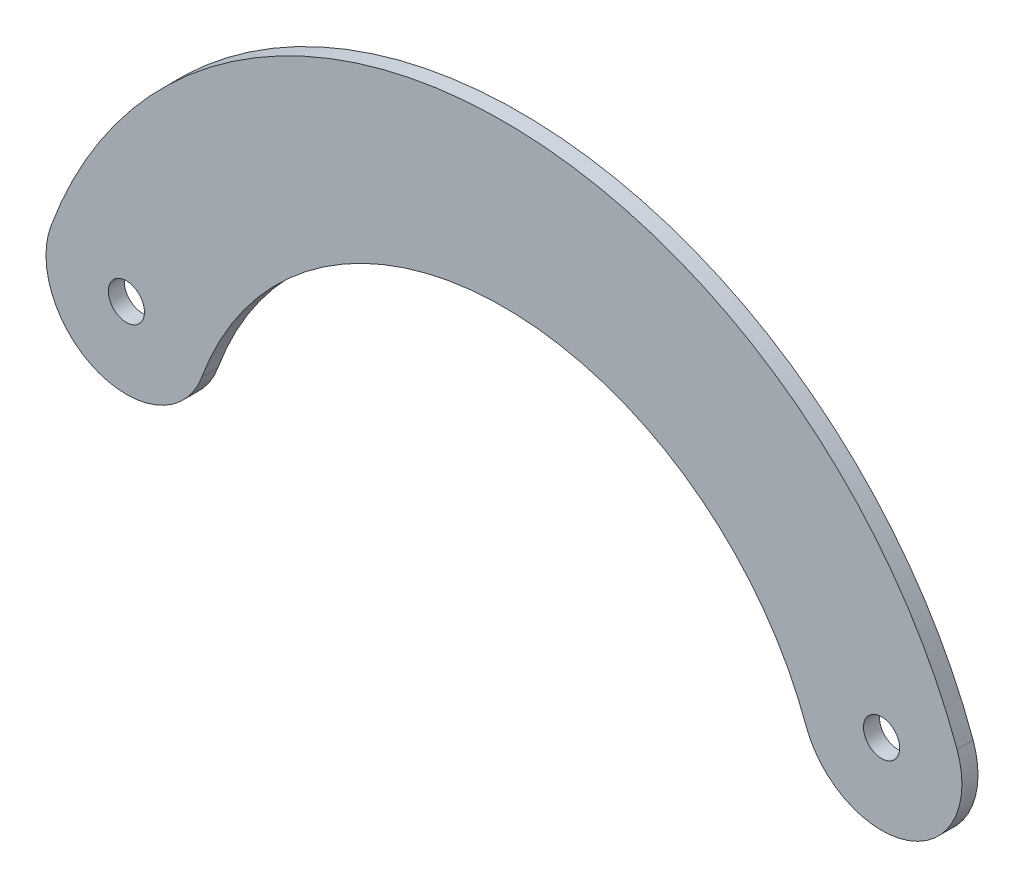
ISO-10303-21;
HEADER;
FILE_DESCRIPTION(('STEP AP214'),'2;1');
FILE_NAME('part.step','',(''),(''),'','','');
FILE_SCHEMA(('AUTOMOTIVE_DESIGN { 1 0 10303 214 1 1 1 1 }'));
ENDSEC;
DATA;
#1=APPLICATION_CONTEXT('core data for automotive mechanical design processes');
#2=APPLICATION_PROTOCOL_DEFINITION('international standard','automotive_design',2000,#1);
#3=PRODUCT_CONTEXT('',#1,'mechanical');
#4=PRODUCT('Part','Part','',(#3));
#5=PRODUCT_RELATED_PRODUCT_CATEGORY('part','',(#4));
#6=PRODUCT_DEFINITION_FORMATION('','',#4);
#7=PRODUCT_DEFINITION_CONTEXT('part definition',#1,'design');
#8=PRODUCT_DEFINITION('design','',#6,#7);
#9=PRODUCT_DEFINITION_SHAPE('','',#8);
#10=(LENGTH_UNIT() NAMED_UNIT(*) SI_UNIT(.MILLI.,.METRE.));
#11=(NAMED_UNIT(*) PLANE_ANGLE_UNIT() SI_UNIT($,.RADIAN.));
#12=(NAMED_UNIT(*) SI_UNIT($,.STERADIAN.) SOLID_ANGLE_UNIT());
#13=UNCERTAINTY_MEASURE_WITH_UNIT(LENGTH_MEASURE(1.E-05),#10,'distance_accuracy_value','');
#14=(GEOMETRIC_REPRESENTATION_CONTEXT(3) GLOBAL_UNCERTAINTY_ASSIGNED_CONTEXT((#13)) GLOBAL_UNIT_ASSIGNED_CONTEXT((#10,
#11,#12)) REPRESENTATION_CONTEXT('',''));
#15=CARTESIAN_POINT('',(0.,0.,0.));
#16=DIRECTION('',(0.,0.,1.));
#17=DIRECTION('',(1.,0.,0.));
#18=AXIS2_PLACEMENT_3D('',#15,#16,#17);
#19=CARTESIAN_POINT('',(-23.4923155196477,8.55050358314164,2.));
#20=DIRECTION('',(0.,0.,1.));
#21=DIRECTION('',(1.,0.,0.));
#22=AXIS2_PLACEMENT_3D('',#19,#20,#21);
#23=PLANE('',#22);
#24=CARTESIAN_POINT('',(-46.9846310392955,17.1010071662833,2.));
#25=DIRECTION('',(0.,0.,1.));
#26=DIRECTION('',(1.,0.,0.));
#27=AXIS2_PLACEMENT_3D('',#24,#25,#26);
#28=CIRCLE('',#27,2.25);
#29=CARTESIAN_POINT('',(-44.7346310392955,17.1010071662833,2.));
#30=VERTEX_POINT('',#29);
#31=EDGE_CURVE('E99',#30,#30,#28,.T.);
#32=ORIENTED_EDGE('',*,*,#31,.F.);
#33=EDGE_LOOP('',(#32));
#34=FACE_BOUND('',#33,.T.);
#35=CARTESIAN_POINT('',(0.,0.,2.));
#36=DIRECTION('',(0.,0.,1.));
#37=DIRECTION('',(1.,0.,0.));
#38=AXIS2_PLACEMENT_3D('',#35,#36,#37);
#39=CIRCLE('',#38,60.);
#40=CARTESIAN_POINT('',(56.3815572471546,20.52120859954,2.));
#41=VERTEX_POINT('',#40);
#42=CARTESIAN_POINT('',(-56.3815572471546,20.5212085995399,2.));
#43=VERTEX_POINT('',#42);
#44=EDGE_CURVE('E84',#41,#43,#39,.T.);
#45=ORIENTED_EDGE('',*,*,#44,.T.);
#46=CARTESIAN_POINT('',(-46.9846310392955,17.1010071662833,2.));
#47=DIRECTION('',(0.,0.,1.));
#48=DIRECTION('',(1.,0.,0.));
#49=AXIS2_PLACEMENT_3D('',#46,#47,#48);
#50=CIRCLE('',#49,10.);
#51=CARTESIAN_POINT('',(-37.5877048314364,13.6808057330266,2.));
#52=VERTEX_POINT('',#51);
#53=EDGE_CURVE('E79',#43,#52,#50,.T.);
#54=ORIENTED_EDGE('',*,*,#53,.T.);
#55=CARTESIAN_POINT('',(0.,0.,2.));
#56=DIRECTION('',(0.,0.,-1.));
#57=DIRECTION('',(1.,0.,0.));
#58=AXIS2_PLACEMENT_3D('',#55,#56,#57);
#59=CIRCLE('',#58,40.);
#60=CARTESIAN_POINT('',(37.5877048314364,13.6808057330266,2.));
#61=VERTEX_POINT('',#60);
#62=EDGE_CURVE('E82',#52,#61,#59,.T.);
#63=ORIENTED_EDGE('',*,*,#62,.T.);
#64=CARTESIAN_POINT('',(46.9846310392955,17.1010071662833,2.));
#65=DIRECTION('',(0.,0.,1.));
#66=DIRECTION('',(1.,0.,0.));
#67=AXIS2_PLACEMENT_3D('',#64,#65,#66);
#68=CIRCLE('',#67,10.);
#69=EDGE_CURVE('E49',#61,#41,#68,.T.);
#70=ORIENTED_EDGE('',*,*,#69,.T.);
#71=EDGE_LOOP('',(#45,#54,#63,#70));
#72=FACE_BOUND('',#71,.T.);
#73=CARTESIAN_POINT('',(46.9846310392955,17.1010071662833,2.));
#74=DIRECTION('',(0.,0.,1.));
#75=DIRECTION('',(1.,0.,0.));
#76=AXIS2_PLACEMENT_3D('',#73,#74,#75);
#77=CIRCLE('',#76,2.25);
#78=CARTESIAN_POINT('',(49.2346310392955,17.1010071662833,2.));
#79=VERTEX_POINT('',#78);
#80=EDGE_CURVE('E114',#79,#79,#77,.T.);
#81=ORIENTED_EDGE('',*,*,#80,.F.);
#82=EDGE_LOOP('',(#81));
#83=FACE_BOUND('',#82,.T.);
#84=ADVANCED_FACE('F32',(#34,#72,#83),#23,.T.);
#85=CARTESIAN_POINT('',(-23.4923155196477,8.55050358314164,0.));
#86=DIRECTION('',(0.,0.,1.));
#87=DIRECTION('',(1.,0.,0.));
#88=AXIS2_PLACEMENT_3D('',#85,#86,#87);
#89=PLANE('',#88);
#90=CARTESIAN_POINT('',(-46.9846310392955,17.1010071662833,0.));
#91=DIRECTION('',(0.,0.,1.));
#92=DIRECTION('',(1.,0.,0.));
#93=AXIS2_PLACEMENT_3D('',#90,#91,#92);
#94=CIRCLE('',#93,2.25);
#95=CARTESIAN_POINT('',(-44.7346310392955,17.1010071662833,0.));
#96=VERTEX_POINT('',#95);
#97=EDGE_CURVE('E111',#96,#96,#94,.T.);
#98=ORIENTED_EDGE('',*,*,#97,.T.);
#99=EDGE_LOOP('',(#98));
#100=FACE_BOUND('',#99,.T.);
#101=CARTESIAN_POINT('',(0.,0.,0.));
#102=DIRECTION('',(0.,0.,1.));
#103=DIRECTION('',(1.,0.,0.));
#104=AXIS2_PLACEMENT_3D('',#101,#102,#103);
#105=CIRCLE('',#104,60.);
#106=CARTESIAN_POINT('',(56.3815572471546,20.52120859954,0.));
#107=VERTEX_POINT('',#106);
#108=CARTESIAN_POINT('',(-56.3815572471546,20.5212085995399,0.));
#109=VERTEX_POINT('',#108);
#110=EDGE_CURVE('E96',#107,#109,#105,.T.);
#111=ORIENTED_EDGE('',*,*,#110,.F.);
#112=CARTESIAN_POINT('',(46.9846310392955,17.1010071662833,0.));
#113=DIRECTION('',(0.,0.,1.));
#114=DIRECTION('',(1.,0.,0.));
#115=AXIS2_PLACEMENT_3D('',#112,#113,#114);
#116=CIRCLE('',#115,10.);
#117=CARTESIAN_POINT('',(37.5877048314364,13.6808057330266,0.));
#118=VERTEX_POINT('',#117);
#119=EDGE_CURVE('E72',#118,#107,#116,.T.);
#120=ORIENTED_EDGE('',*,*,#119,.F.);
#121=CARTESIAN_POINT('',(0.,0.,0.));
#122=DIRECTION('',(0.,0.,-1.));
#123=DIRECTION('',(1.,0.,0.));
#124=AXIS2_PLACEMENT_3D('',#121,#122,#123);
#125=CIRCLE('',#124,40.);
#126=CARTESIAN_POINT('',(-37.5877048314364,13.6808057330266,0.));
#127=VERTEX_POINT('',#126);
#128=EDGE_CURVE('E66',#127,#118,#125,.T.);
#129=ORIENTED_EDGE('',*,*,#128,.F.);
#130=CARTESIAN_POINT('',(-46.9846310392955,17.1010071662833,0.));
#131=DIRECTION('',(0.,0.,1.));
#132=DIRECTION('',(1.,0.,0.));
#133=AXIS2_PLACEMENT_3D('',#130,#131,#132);
#134=CIRCLE('',#133,10.);
#135=EDGE_CURVE('E88',#109,#127,#134,.T.);
#136=ORIENTED_EDGE('',*,*,#135,.F.);
#137=EDGE_LOOP('',(#111,#120,#129,#136));
#138=FACE_BOUND('',#137,.T.);
#139=CARTESIAN_POINT('',(46.9846310392955,17.1010071662833,0.));
#140=DIRECTION('',(0.,0.,1.));
#141=DIRECTION('',(1.,0.,0.));
#142=AXIS2_PLACEMENT_3D('',#139,#140,#141);
#143=CIRCLE('',#142,2.25);
#144=CARTESIAN_POINT('',(49.2346310392955,17.1010071662833,0.));
#145=VERTEX_POINT('',#144);
#146=EDGE_CURVE('E117',#145,#145,#143,.T.);
#147=ORIENTED_EDGE('',*,*,#146,.T.);
#148=EDGE_LOOP('',(#147));
#149=FACE_BOUND('',#148,.T.);
#150=ADVANCED_FACE('F107',(#100,#138,#149),#89,.F.);
#151=CARTESIAN_POINT('',(0.,0.,2.));
#152=DIRECTION('',(0.,0.,-1.));
#153=DIRECTION('',(-1.,0.,0.));
#154=AXIS2_PLACEMENT_3D('',#151,#152,#153);
#155=CYLINDRICAL_SURFACE('',#154,60.);
#156=ORIENTED_EDGE('',*,*,#110,.T.);
#157=DIRECTION('',(0.,0.,-1.));
#158=VECTOR('',#157,1.);
#159=CARTESIAN_POINT('',(-56.3815572471546,20.5212085995399,2.));
#160=LINE('',#159,#158);
#161=EDGE_CURVE('E11',#43,#109,#160,.T.);
#162=ORIENTED_EDGE('',*,*,#161,.F.);
#163=ORIENTED_EDGE('',*,*,#44,.F.);
#164=DIRECTION('',(0.,0.,-1.));
#165=VECTOR('',#164,1.);
#166=CARTESIAN_POINT('',(56.3815572471546,20.52120859954,2.));
#167=LINE('',#166,#165);
#168=EDGE_CURVE('E92',#41,#107,#167,.T.);
#169=ORIENTED_EDGE('',*,*,#168,.T.);
#170=EDGE_LOOP('',(#156,#162,#163,#169));
#171=FACE_BOUND('',#170,.T.);
#172=ADVANCED_FACE('F34',(#171),#155,.T.);
#173=CARTESIAN_POINT('',(-46.9846310392955,17.1010071662833,2.));
#174=DIRECTION('',(0.,0.,-1.));
#175=DIRECTION('',(-1.,0.,0.));
#176=AXIS2_PLACEMENT_3D('',#173,#174,#175);
#177=CYLINDRICAL_SURFACE('',#176,10.);
#178=ORIENTED_EDGE('',*,*,#135,.T.);
#179=DIRECTION('',(0.,0.,-1.));
#180=VECTOR('',#179,1.);
#181=CARTESIAN_POINT('',(-37.5877048314364,13.6808057330266,2.));
#182=LINE('',#181,#180);
#183=EDGE_CURVE('E41',#52,#127,#182,.T.);
#184=ORIENTED_EDGE('',*,*,#183,.F.);
#185=ORIENTED_EDGE('',*,*,#53,.F.);
#186=ORIENTED_EDGE('',*,*,#161,.T.);
#187=EDGE_LOOP('',(#178,#184,#185,#186));
#188=FACE_BOUND('',#187,.T.);
#189=ADVANCED_FACE('F87',(#188),#177,.T.);
#190=CARTESIAN_POINT('',(0.,0.,2.));
#191=DIRECTION('',(0.,0.,-1.));
#192=DIRECTION('',(-1.,0.,0.));
#193=AXIS2_PLACEMENT_3D('',#190,#191,#192);
#194=CYLINDRICAL_SURFACE('',#193,40.);
#195=ORIENTED_EDGE('',*,*,#128,.T.);
#196=DIRECTION('',(0.,0.,-1.));
#197=VECTOR('',#196,1.);
#198=CARTESIAN_POINT('',(37.5877048314364,13.6808057330266,2.));
#199=LINE('',#198,#197);
#200=EDGE_CURVE('E89',#61,#118,#199,.T.);
#201=ORIENTED_EDGE('',*,*,#200,.F.);
#202=ORIENTED_EDGE('',*,*,#62,.F.);
#203=ORIENTED_EDGE('',*,*,#183,.T.);
#204=EDGE_LOOP('',(#195,#201,#202,#203));
#205=FACE_BOUND('',#204,.T.);
#206=ADVANCED_FACE('F90',(#205),#194,.F.);
#207=CARTESIAN_POINT('',(46.9846310392955,17.1010071662833,2.));
#208=DIRECTION('',(0.,0.,-1.));
#209=DIRECTION('',(-1.,0.,0.));
#210=AXIS2_PLACEMENT_3D('',#207,#208,#209);
#211=CYLINDRICAL_SURFACE('',#210,10.);
#212=ORIENTED_EDGE('',*,*,#119,.T.);
#213=ORIENTED_EDGE('',*,*,#168,.F.);
#214=ORIENTED_EDGE('',*,*,#69,.F.);
#215=ORIENTED_EDGE('',*,*,#200,.T.);
#216=EDGE_LOOP('',(#212,#213,#214,#215));
#217=FACE_BOUND('',#216,.T.);
#218=ADVANCED_FACE('F104',(#217),#211,.T.);
#219=CARTESIAN_POINT('',(-46.9846310392955,17.1010071662833,2.));
#220=DIRECTION('',(0.,0.,-1.));
#221=DIRECTION('',(-1.,0.,0.));
#222=AXIS2_PLACEMENT_3D('',#219,#220,#221);
#223=CYLINDRICAL_SURFACE('',#222,2.25);
#224=ORIENTED_EDGE('',*,*,#31,.T.);
#225=EDGE_LOOP('',(#224));
#226=FACE_BOUND('',#225,.T.);
#227=ORIENTED_EDGE('',*,*,#97,.F.);
#228=EDGE_LOOP('',(#227));
#229=FACE_BOUND('',#228,.T.);
#230=ADVANCED_FACE('F135',(#226,#229),#223,.F.);
#231=CARTESIAN_POINT('',(46.9846310392955,17.1010071662833,2.));
#232=DIRECTION('',(0.,0.,-1.));
#233=DIRECTION('',(-1.,0.,0.));
#234=AXIS2_PLACEMENT_3D('',#231,#232,#233);
#235=CYLINDRICAL_SURFACE('',#234,2.25);
#236=ORIENTED_EDGE('',*,*,#80,.T.);
#237=EDGE_LOOP('',(#236));
#238=FACE_BOUND('',#237,.T.);
#239=ORIENTED_EDGE('',*,*,#146,.F.);
#240=EDGE_LOOP('',(#239));
#241=FACE_BOUND('',#240,.T.);
#242=ADVANCED_FACE('F123',(#238,#241),#235,.F.);
#243=CLOSED_SHELL('',(#84,#150,#172,#189,#206,#218,#230,#242));
#244=MANIFOLD_SOLID_BREP('B2',#243);
#245=ADVANCED_BREP_SHAPE_REPRESENTATION('',(#18,#244),#14);
#246=SHAPE_DEFINITION_REPRESENTATION(#9,#245);
ENDSEC;
END-ISO-10303-21;
